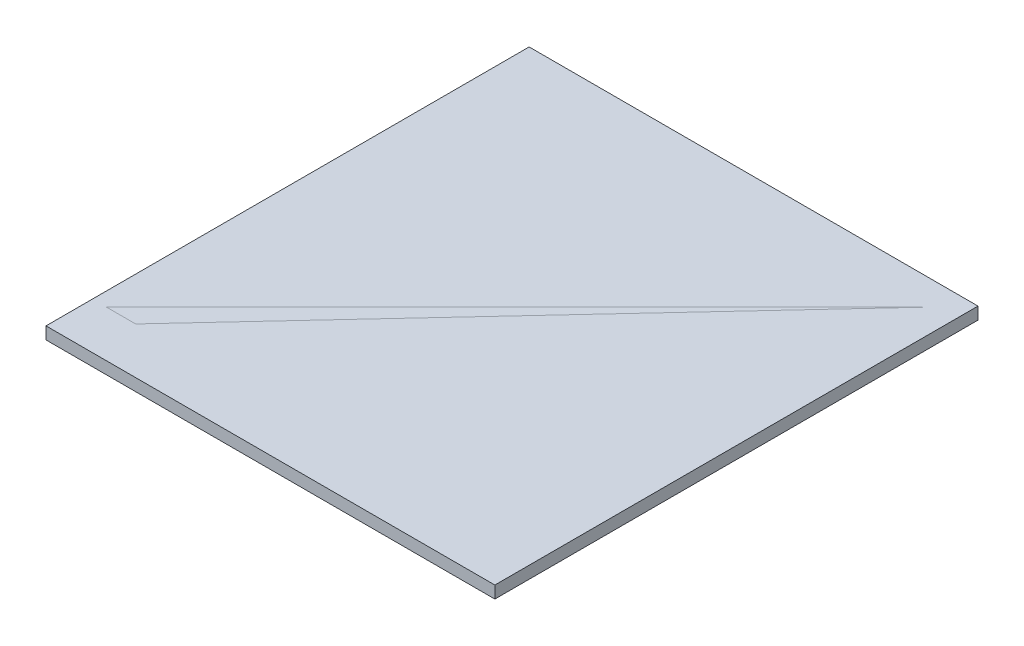
ISO-10303-21;
HEADER;
FILE_DESCRIPTION(('STEP AP214'),'2;1');
FILE_NAME('part.step','',(''),(''),'','','');
FILE_SCHEMA(('AUTOMOTIVE_DESIGN { 1 0 10303 214 1 1 1 1 }'));
ENDSEC;
DATA;
#1=APPLICATION_CONTEXT('core data for automotive mechanical design processes');
#2=APPLICATION_PROTOCOL_DEFINITION('international standard','automotive_design',2000,#1);
#3=PRODUCT_CONTEXT('',#1,'mechanical');
#4=PRODUCT('Part','Part','',(#3));
#5=PRODUCT_RELATED_PRODUCT_CATEGORY('part','',(#4));
#6=PRODUCT_DEFINITION_FORMATION('','',#4);
#7=PRODUCT_DEFINITION_CONTEXT('part definition',#1,'design');
#8=PRODUCT_DEFINITION('design','',#6,#7);
#9=PRODUCT_DEFINITION_SHAPE('','',#8);
#10=(LENGTH_UNIT() NAMED_UNIT(*) SI_UNIT(.MILLI.,.METRE.));
#11=(NAMED_UNIT(*) PLANE_ANGLE_UNIT() SI_UNIT($,.RADIAN.));
#12=(NAMED_UNIT(*) SI_UNIT($,.STERADIAN.) SOLID_ANGLE_UNIT());
#13=UNCERTAINTY_MEASURE_WITH_UNIT(LENGTH_MEASURE(1.E-05),#10,'distance_accuracy_value','');
#14=(GEOMETRIC_REPRESENTATION_CONTEXT(3) GLOBAL_UNCERTAINTY_ASSIGNED_CONTEXT((#13)) GLOBAL_UNIT_ASSIGNED_CONTEXT((#10,
#11,#12)) REPRESENTATION_CONTEXT('',''));
#15=CARTESIAN_POINT('',(0.,0.,0.));
#16=DIRECTION('',(0.,0.,1.));
#17=DIRECTION('',(1.,0.,0.));
#18=AXIS2_PLACEMENT_3D('',#15,#16,#17);
#19=CARTESIAN_POINT('',(20.98,0.8,-1.2499696215504));
#20=CARTESIAN_POINT('',(20.98,0.8,-0.833313081033602));
#21=CARTESIAN_POINT('',(20.98,0.8,-0.416656540516802));
#22=CARTESIAN_POINT('',(20.98,0.8,0.));
#23=CARTESIAN_POINT('',(16.8133333333333,0.8,-1.2499696215504));
#24=CARTESIAN_POINT('',(16.8133333333333,0.8,-0.833313081033602));
#25=CARTESIAN_POINT('',(16.8133333333333,0.8,-0.416656540516801));
#26=CARTESIAN_POINT('',(16.8133333333333,0.8,0.));
#27=CARTESIAN_POINT('',(12.6466666666667,0.8,-1.2499696215504));
#28=CARTESIAN_POINT('',(12.6466666666667,0.8,-0.833313081033601));
#29=CARTESIAN_POINT('',(12.6466666666667,0.8,-0.416656540516801));
#30=CARTESIAN_POINT('',(12.6466666666667,0.8,0.));
#31=CARTESIAN_POINT('',(8.48,0.8,-1.2499696215504));
#32=CARTESIAN_POINT('',(8.48,0.8,-0.8333130810336));
#33=CARTESIAN_POINT('',(8.48,0.8,-0.4166565405168));
#34=CARTESIAN_POINT('',(8.48,0.8,0.));
#35=B_SPLINE_SURFACE_WITH_KNOTS('',3,3,((#19,#20,#21,#22),(#23,#24,#25,#26),(#27,#28,#29,#30),
(#31,#32,#33,#34)),.UNSPECIFIED.,.F.,.F.,.F.,(4,4),(4,4),(0.,1.),(0.,1.),.UNSPECIFIED.);
#36=CARTESIAN_POINT('',(20.98,0.8,-1.2499696215504));
#37=CARTESIAN_POINT('',(16.8133333333333,0.8,-1.2499696215504));
#38=CARTESIAN_POINT('',(12.6466666666667,0.8,-1.2499696215504));
#39=CARTESIAN_POINT('',(8.48,0.8,-1.2499696215504));
#40=B_SPLINE_CURVE_WITH_KNOTS('',3,(#36,#37,#38,#39),.UNSPECIFIED.,.F.,.F.,(4,4),(0.,1.),.UNSPECIFIED.);
#41=CARTESIAN_POINT('',(20.98,0.8,-1.2499696215504));
#42=VERTEX_POINT('',#41);
#43=CARTESIAN_POINT('',(8.48,0.8,-1.2499696215504));
#44=VERTEX_POINT('',#43);
#45=EDGE_CURVE('E14',#42,#44,#40,.T.);
#46=CARTESIAN_POINT('',(8.48,0.8,-1.2499696215504));
#47=CARTESIAN_POINT('',(8.48,0.8,-0.8333130810336));
#48=CARTESIAN_POINT('',(8.48,0.8,-0.4166565405168));
#49=CARTESIAN_POINT('',(8.48,0.8,0.));
#50=B_SPLINE_CURVE_WITH_KNOTS('',3,(#46,#47,#48,#49),.UNSPECIFIED.,.F.,.F.,(4,4),(0.,1.),.UNSPECIFIED.);
#51=CARTESIAN_POINT('',(8.48,0.8,0.));
#52=VERTEX_POINT('',#51);
#53=EDGE_CURVE('E111',#44,#52,#50,.T.);
#54=CARTESIAN_POINT('',(20.98,0.8,0.));
#55=CARTESIAN_POINT('',(16.8133333333333,0.8,0.));
#56=CARTESIAN_POINT('',(12.6466666666667,0.8,0.));
#57=CARTESIAN_POINT('',(8.48,0.8,0.));
#58=B_SPLINE_CURVE_WITH_KNOTS('',3,(#54,#55,#56,#57),.UNSPECIFIED.,.F.,.F.,(4,4),(0.,1.),.UNSPECIFIED.);
#59=CARTESIAN_POINT('',(20.98,0.8,0.));
#60=VERTEX_POINT('',#59);
#61=EDGE_CURVE('E119',#52,#60,#58,.F.);
#62=CARTESIAN_POINT('',(20.98,0.8,-1.2499696215504));
#63=CARTESIAN_POINT('',(20.98,0.8,-0.833313081033602));
#64=CARTESIAN_POINT('',(20.98,0.8,-0.416656540516802));
#65=CARTESIAN_POINT('',(20.98,0.8,0.));
#66=B_SPLINE_CURVE_WITH_KNOTS('',3,(#62,#63,#64,#65),.UNSPECIFIED.,.F.,.F.,(4,4),(0.,1.),.UNSPECIFIED.);
#67=EDGE_CURVE('E103',#60,#42,#66,.F.);
#68=ORIENTED_EDGE('',*,*,#45,.T.);
#69=ORIENTED_EDGE('',*,*,#53,.T.);
#70=ORIENTED_EDGE('',*,*,#61,.T.);
#71=ORIENTED_EDGE('',*,*,#67,.T.);
#72=EDGE_LOOP('',(#68,#69,#70,#71));
#73=FACE_BOUND('',#72,.T.);
#74=ADVANCED_FACE('F100',(#73),#35,.T.);
#75=OPEN_SHELL('',(#74));
#76=SHELL_BASED_SURFACE_MODEL('B2',(#75));
#77=CARTESIAN_POINT('',(28.56,0.8,-30.71));
#78=CARTESIAN_POINT('',(28.56,0.8,-21.49));
#79=CARTESIAN_POINT('',(28.56,0.8,-12.27));
#80=CARTESIAN_POINT('',(28.56,0.8,-3.05));
#81=CARTESIAN_POINT('',(19.34,0.8,-30.71));
#82=CARTESIAN_POINT('',(19.34,0.8,-21.49));
#83=CARTESIAN_POINT('',(19.34,0.8,-12.27));
#84=CARTESIAN_POINT('',(19.34,0.8,-3.05));
#85=CARTESIAN_POINT('',(10.12,0.8,-30.71));
#86=CARTESIAN_POINT('',(10.12,0.8,-21.49));
#87=CARTESIAN_POINT('',(10.12,0.8,-12.27));
#88=CARTESIAN_POINT('',(10.12,0.8,-3.05));
#89=CARTESIAN_POINT('',(0.899999999999998,0.8,-30.71));
#90=CARTESIAN_POINT('',(0.899999999999999,0.8,-21.49));
#91=CARTESIAN_POINT('',(0.9,0.8,-12.27));
#92=CARTESIAN_POINT('',(0.900000000000001,0.8,-3.05));
#93=B_SPLINE_SURFACE_WITH_KNOTS('',3,3,((#77,#78,#79,#80),(#81,#82,#83,#84),(#85,#86,#87,#88),
(#89,#90,#91,#92)),.UNSPECIFIED.,.F.,.F.,.F.,(4,4),(4,4),(0.,1.),(0.,1.),.UNSPECIFIED.);
#94=CARTESIAN_POINT('',(28.56,0.8,-30.71));
#95=CARTESIAN_POINT('',(19.34,0.8,-30.71));
#96=CARTESIAN_POINT('',(10.12,0.8,-30.71));
#97=CARTESIAN_POINT('',(0.899999999999998,0.8,-30.71));
#98=B_SPLINE_CURVE_WITH_KNOTS('',3,(#94,#95,#96,#97),.UNSPECIFIED.,.F.,.F.,(4,4),(0.,1.),.UNSPECIFIED.);
#99=CARTESIAN_POINT('',(28.56,0.8,-30.71));
#100=VERTEX_POINT('',#99);
#101=CARTESIAN_POINT('',(0.899999999999998,0.8,-30.71));
#102=VERTEX_POINT('',#101);
#103=EDGE_CURVE('E98',#100,#102,#98,.T.);
#104=CARTESIAN_POINT('',(0.899999999999998,0.8,-30.71));
#105=CARTESIAN_POINT('',(0.899999999999999,0.8,-21.49));
#106=CARTESIAN_POINT('',(0.9,0.8,-12.27));
#107=CARTESIAN_POINT('',(0.900000000000001,0.8,-3.05));
#108=B_SPLINE_CURVE_WITH_KNOTS('',3,(#104,#105,#106,#107),.UNSPECIFIED.,.F.,.F.,(4,4),(0.,1.),.UNSPECIFIED.);
#109=CARTESIAN_POINT('',(0.900000000000001,0.8,-3.05));
#110=VERTEX_POINT('',#109);
#111=EDGE_CURVE('E189',#102,#110,#108,.T.);
#112=CARTESIAN_POINT('',(28.56,0.8,-3.05));
#113=CARTESIAN_POINT('',(19.34,0.8,-3.05));
#114=CARTESIAN_POINT('',(10.12,0.8,-3.05));
#115=CARTESIAN_POINT('',(0.900000000000001,0.8,-3.05));
#116=B_SPLINE_CURVE_WITH_KNOTS('',3,(#112,#113,#114,#115),.UNSPECIFIED.,.F.,.F.,(4,4),(0.,1.),.UNSPECIFIED.);
#117=CARTESIAN_POINT('',(28.56,0.8,-3.05));
#118=VERTEX_POINT('',#117);
#119=EDGE_CURVE('E197',#110,#118,#116,.F.);
#120=CARTESIAN_POINT('',(28.56,0.8,-30.71));
#121=CARTESIAN_POINT('',(28.56,0.8,-21.49));
#122=CARTESIAN_POINT('',(28.56,0.8,-12.27));
#123=CARTESIAN_POINT('',(28.56,0.8,-3.05));
#124=B_SPLINE_CURVE_WITH_KNOTS('',3,(#120,#121,#122,#123),.UNSPECIFIED.,.F.,.F.,(4,4),(0.,1.),.UNSPECIFIED.);
#125=EDGE_CURVE('E181',#118,#100,#124,.F.);
#126=ORIENTED_EDGE('',*,*,#103,.T.);
#127=ORIENTED_EDGE('',*,*,#111,.T.);
#128=ORIENTED_EDGE('',*,*,#119,.T.);
#129=ORIENTED_EDGE('',*,*,#125,.T.);
#130=EDGE_LOOP('',(#126,#127,#128,#129));
#131=FACE_BOUND('',#130,.T.);
#132=ADVANCED_FACE('F178',(#131),#93,.T.);
#133=OPEN_SHELL('',(#132));
#134=SHELL_BASED_SURFACE_MODEL('B8',(#133));
#135=CARTESIAN_POINT('',(0.,0.8,0.));
#136=DIRECTION('',(1.,0.,0.));
#137=DIRECTION('',(0.,0.,-1.));
#138=AXIS2_PLACEMENT_3D('',#135,#136,#137);
#139=PLANE('',#138);
#140=DIRECTION('',(0.,0.,1.));
#141=VECTOR('',#140,1.);
#142=CARTESIAN_POINT('',(0.,0.,0.));
#143=LINE('',#142,#141);
#144=CARTESIAN_POINT('',(0.,0.,-31.71));
#145=VERTEX_POINT('',#144);
#146=CARTESIAN_POINT('',(0.,0.,0.));
#147=VERTEX_POINT('',#146);
#148=EDGE_CURVE('E315',#145,#147,#143,.T.);
#149=ORIENTED_EDGE('',*,*,#148,.T.);
#150=DIRECTION('',(0.,-1.,0.));
#151=VECTOR('',#150,1.);
#152=CARTESIAN_POINT('',(0.,0.8,0.));
#153=LINE('',#152,#151);
#154=CARTESIAN_POINT('',(0.,0.8,0.));
#155=VERTEX_POINT('',#154);
#156=EDGE_CURVE('E176',#155,#147,#153,.T.);
#157=ORIENTED_EDGE('',*,*,#156,.F.);
#158=DIRECTION('',(0.,0.,1.));
#159=VECTOR('',#158,1.);
#160=CARTESIAN_POINT('',(0.,0.8,0.));
#161=LINE('',#160,#159);
#162=CARTESIAN_POINT('',(0.,0.8,-31.71));
#163=VERTEX_POINT('',#162);
#164=EDGE_CURVE('E299',#163,#155,#161,.T.);
#165=ORIENTED_EDGE('',*,*,#164,.F.);
#166=DIRECTION('',(0.,-1.,0.));
#167=VECTOR('',#166,1.);
#168=CARTESIAN_POINT('',(0.,0.8,-31.71));
#169=LINE('',#168,#167);
#170=EDGE_CURVE('E311',#163,#145,#169,.T.);
#171=ORIENTED_EDGE('',*,*,#170,.T.);
#172=EDGE_LOOP('',(#149,#157,#165,#171));
#173=FACE_BOUND('',#172,.T.);
#174=ADVANCED_FACE('F247',(#173),#139,.F.);
#175=CARTESIAN_POINT('',(0.,0.8,0.));
#176=DIRECTION('',(0.,0.,-1.));
#177=DIRECTION('',(-1.,0.,0.));
#178=AXIS2_PLACEMENT_3D('',#175,#176,#177);
#179=PLANE('',#178);
#180=DIRECTION('',(1.,0.,0.));
#181=VECTOR('',#180,1.);
#182=CARTESIAN_POINT('',(0.,0.,0.));
#183=LINE('',#182,#181);
#184=CARTESIAN_POINT('',(29.46,0.,0.));
#185=VERTEX_POINT('',#184);
#186=EDGE_CURVE('E304',#147,#185,#183,.T.);
#187=ORIENTED_EDGE('',*,*,#186,.T.);
#188=DIRECTION('',(0.,-1.,0.));
#189=VECTOR('',#188,1.);
#190=CARTESIAN_POINT('',(29.46,0.8,0.));
#191=LINE('',#190,#189);
#192=CARTESIAN_POINT('',(29.46,0.8,0.));
#193=VERTEX_POINT('',#192);
#194=EDGE_CURVE('E256',#193,#185,#191,.T.);
#195=ORIENTED_EDGE('',*,*,#194,.F.);
#196=DIRECTION('',(1.,0.,0.));
#197=VECTOR('',#196,1.);
#198=CARTESIAN_POINT('',(0.,0.8,0.));
#199=LINE('',#198,#197);
#200=EDGE_CURVE('E294',#155,#193,#199,.T.);
#201=ORIENTED_EDGE('',*,*,#200,.F.);
#202=ORIENTED_EDGE('',*,*,#156,.T.);
#203=EDGE_LOOP('',(#187,#195,#201,#202));
#204=FACE_BOUND('',#203,.T.);
#205=ADVANCED_FACE('F303',(#204),#179,.F.);
#206=CARTESIAN_POINT('',(29.46,0.8,0.));
#207=DIRECTION('',(-1.,0.,0.));
#208=DIRECTION('',(0.,0.,1.));
#209=AXIS2_PLACEMENT_3D('',#206,#207,#208);
#210=PLANE('',#209);
#211=DIRECTION('',(0.,0.,-1.));
#212=VECTOR('',#211,1.);
#213=CARTESIAN_POINT('',(29.46,0.,0.));
#214=LINE('',#213,#212);
#215=CARTESIAN_POINT('',(29.46,0.,-31.71));
#216=VERTEX_POINT('',#215);
#217=EDGE_CURVE('E281',#185,#216,#214,.T.);
#218=ORIENTED_EDGE('',*,*,#217,.T.);
#219=DIRECTION('',(0.,-1.,0.));
#220=VECTOR('',#219,1.);
#221=CARTESIAN_POINT('',(29.46,0.8,-31.71));
#222=LINE('',#221,#220);
#223=CARTESIAN_POINT('',(29.46,0.8,-31.71));
#224=VERTEX_POINT('',#223);
#225=EDGE_CURVE('E306',#224,#216,#222,.T.);
#226=ORIENTED_EDGE('',*,*,#225,.F.);
#227=DIRECTION('',(0.,0.,-1.));
#228=VECTOR('',#227,1.);
#229=CARTESIAN_POINT('',(29.46,0.8,0.));
#230=LINE('',#229,#228);
#231=EDGE_CURVE('E297',#193,#224,#230,.T.);
#232=ORIENTED_EDGE('',*,*,#231,.F.);
#233=ORIENTED_EDGE('',*,*,#194,.T.);
#234=EDGE_LOOP('',(#218,#226,#232,#233));
#235=FACE_BOUND('',#234,.T.);
#236=ADVANCED_FACE('F307',(#235),#210,.F.);
#237=CARTESIAN_POINT('',(0.,0.8,-31.71));
#238=DIRECTION('',(0.,0.,1.));
#239=DIRECTION('',(1.,0.,0.));
#240=AXIS2_PLACEMENT_3D('',#237,#238,#239);
#241=PLANE('',#240);
#242=DIRECTION('',(-1.,0.,0.));
#243=VECTOR('',#242,1.);
#244=CARTESIAN_POINT('',(0.,0.,-31.71));
#245=LINE('',#244,#243);
#246=EDGE_CURVE('E287',#216,#145,#245,.T.);
#247=ORIENTED_EDGE('',*,*,#246,.T.);
#248=ORIENTED_EDGE('',*,*,#170,.F.);
#249=DIRECTION('',(-1.,0.,0.));
#250=VECTOR('',#249,1.);
#251=CARTESIAN_POINT('',(0.,0.8,-31.71));
#252=LINE('',#251,#250);
#253=EDGE_CURVE('E264',#224,#163,#252,.T.);
#254=ORIENTED_EDGE('',*,*,#253,.F.);
#255=ORIENTED_EDGE('',*,*,#225,.T.);
#256=EDGE_LOOP('',(#247,#248,#254,#255));
#257=FACE_BOUND('',#256,.T.);
#258=ADVANCED_FACE('F328',(#257),#241,.F.);
#259=CARTESIAN_POINT('',(0.,0.8,0.));
#260=DIRECTION('',(0.,-1.,0.));
#261=DIRECTION('',(0.,0.,-1.));
#262=AXIS2_PLACEMENT_3D('',#259,#260,#261);
#263=PLANE('',#262);
#264=ORIENTED_EDGE('',*,*,#164,.T.);
#265=ORIENTED_EDGE('',*,*,#200,.T.);
#266=ORIENTED_EDGE('',*,*,#231,.T.);
#267=ORIENTED_EDGE('',*,*,#253,.T.);
#268=EDGE_LOOP('',(#264,#265,#266,#267));
#269=FACE_BOUND('',#268,.T.);
#270=ADVANCED_FACE('F295',(#269),#263,.F.);
#271=CARTESIAN_POINT('',(0.,0.,0.));
#272=DIRECTION('',(0.,-1.,0.));
#273=DIRECTION('',(0.,0.,-1.));
#274=AXIS2_PLACEMENT_3D('',#271,#272,#273);
#275=PLANE('',#274);
#276=ORIENTED_EDGE('',*,*,#148,.F.);
#277=ORIENTED_EDGE('',*,*,#246,.F.);
#278=ORIENTED_EDGE('',*,*,#217,.F.);
#279=ORIENTED_EDGE('',*,*,#186,.F.);
#280=EDGE_LOOP('',(#276,#277,#278,#279));
#281=FACE_BOUND('',#280,.T.);
#282=ADVANCED_FACE('F331',(#281),#275,.T.);
#283=CLOSED_SHELL('',(#174,#205,#236,#258,#270,#282));
#284=MANIFOLD_SOLID_BREP('B92',#283);
#285=ADVANCED_BREP_SHAPE_REPRESENTATION('',(#18,#284),#14);
#286=MANIFOLD_SURFACE_SHAPE_REPRESENTATION('',(#18,#76,#134),#14);
#287=SHAPE_REPRESENTATION('',(#18),#14);
#288=SHAPE_DEFINITION_REPRESENTATION(#9,#287);
#289=SHAPE_REPRESENTATION_RELATIONSHIP('','',#287,#285);
#290=SHAPE_REPRESENTATION_RELATIONSHIP('','',#287,#286);
ENDSEC;
END-ISO-10303-21;
